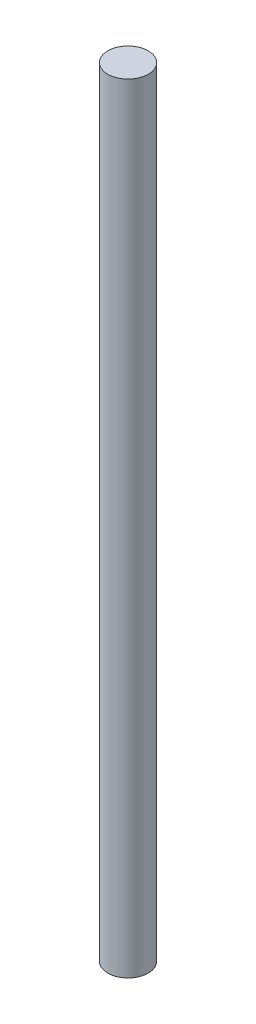
ISO-10303-21;
HEADER;
FILE_DESCRIPTION(('STEP AP214'),'2;1');
FILE_NAME('part.step','',(''),(''),'','','');
FILE_SCHEMA(('AUTOMOTIVE_DESIGN { 1 0 10303 214 1 1 1 1 }'));
ENDSEC;
DATA;
#1=APPLICATION_CONTEXT('core data for automotive mechanical design processes');
#2=APPLICATION_PROTOCOL_DEFINITION('international standard','automotive_design',2000,#1);
#3=PRODUCT_CONTEXT('',#1,'mechanical');
#4=PRODUCT('Part','Part','',(#3));
#5=PRODUCT_RELATED_PRODUCT_CATEGORY('part','',(#4));
#6=PRODUCT_DEFINITION_FORMATION('','',#4);
#7=PRODUCT_DEFINITION_CONTEXT('part definition',#1,'design');
#8=PRODUCT_DEFINITION('design','',#6,#7);
#9=PRODUCT_DEFINITION_SHAPE('','',#8);
#10=(LENGTH_UNIT() NAMED_UNIT(*) SI_UNIT(.MILLI.,.METRE.));
#11=(NAMED_UNIT(*) PLANE_ANGLE_UNIT() SI_UNIT($,.RADIAN.));
#12=(NAMED_UNIT(*) SI_UNIT($,.STERADIAN.) SOLID_ANGLE_UNIT());
#13=UNCERTAINTY_MEASURE_WITH_UNIT(LENGTH_MEASURE(1.E-05),#10,'distance_accuracy_value','');
#14=(GEOMETRIC_REPRESENTATION_CONTEXT(3) GLOBAL_UNCERTAINTY_ASSIGNED_CONTEXT((#13)) GLOBAL_UNIT_ASSIGNED_CONTEXT((#10,
#11,#12)) REPRESENTATION_CONTEXT('',''));
#15=CARTESIAN_POINT('',(0.,0.,0.));
#16=DIRECTION('',(0.,0.,1.));
#17=DIRECTION('',(1.,0.,0.));
#18=AXIS2_PLACEMENT_3D('',#15,#16,#17);
#19=CARTESIAN_POINT('',(0.,152.4,0.));
#20=DIRECTION('',(0.,-1.,0.));
#21=DIRECTION('',(0.,0.,-1.));
#22=AXIS2_PLACEMENT_3D('',#19,#20,#21);
#23=CYLINDRICAL_SURFACE('',#22,3.96875);
#24=CARTESIAN_POINT('',(0.,152.4,0.));
#25=DIRECTION('',(0.,1.,0.));
#26=DIRECTION('',(0.,0.,1.));
#27=AXIS2_PLACEMENT_3D('',#24,#25,#26);
#28=CIRCLE('',#27,3.96875);
#29=CARTESIAN_POINT('',(0.,152.4,-3.96875));
#30=VERTEX_POINT('',#29);
#31=EDGE_CURVE('E10',#30,#30,#28,.T.);
#32=CARTESIAN_POINT('',(0.,0.,0.));
#33=DIRECTION('',(0.,1.,0.));
#34=DIRECTION('',(0.,0.,1.));
#35=AXIS2_PLACEMENT_3D('',#32,#33,#34);
#36=CIRCLE('',#35,3.96875);
#37=CARTESIAN_POINT('',(0.,0.,-3.96875));
#38=VERTEX_POINT('',#37);
#39=EDGE_CURVE('E46',#38,#38,#36,.T.);
#40=CARTESIAN_POINT('',(0.,152.4,-3.96875));
#41=CARTESIAN_POINT('',(0.,150.8125,-3.96875));
#42=CARTESIAN_POINT('',(0.,149.225,-3.96875));
#43=CARTESIAN_POINT('',(0.,146.05,-3.96875));
#44=CARTESIAN_POINT('',(0.,144.4625,-3.96875));
#45=CARTESIAN_POINT('',(0.,141.2875,-3.96875));
#46=CARTESIAN_POINT('',(0.,139.7,-3.96875));
#47=CARTESIAN_POINT('',(0.,136.525,-3.96875));
#48=CARTESIAN_POINT('',(0.,134.9375,-3.96875));
#49=CARTESIAN_POINT('',(0.,131.7625,-3.96875));
#50=CARTESIAN_POINT('',(0.,130.175,-3.96875));
#51=CARTESIAN_POINT('',(0.,127.,-3.96875));
#52=CARTESIAN_POINT('',(0.,125.4125,-3.96875));
#53=CARTESIAN_POINT('',(0.,122.2375,-3.96875));
#54=CARTESIAN_POINT('',(0.,120.65,-3.96875));
#55=CARTESIAN_POINT('',(0.,117.475,-3.96875));
#56=CARTESIAN_POINT('',(0.,115.8875,-3.96875));
#57=CARTESIAN_POINT('',(0.,112.7125,-3.96875));
#58=CARTESIAN_POINT('',(0.,111.125,-3.96875));
#59=CARTESIAN_POINT('',(0.,107.95,-3.96875));
#60=CARTESIAN_POINT('',(0.,106.3625,-3.96875));
#61=CARTESIAN_POINT('',(0.,103.1875,-3.96875));
#62=CARTESIAN_POINT('',(0.,101.6,-3.96875));
#63=CARTESIAN_POINT('',(0.,98.425,-3.96875));
#64=CARTESIAN_POINT('',(0.,96.8375,-3.96875));
#65=CARTESIAN_POINT('',(0.,93.6625,-3.96875));
#66=CARTESIAN_POINT('',(0.,92.075,-3.96875));
#67=CARTESIAN_POINT('',(0.,88.9,-3.96875));
#68=CARTESIAN_POINT('',(0.,87.3125,-3.96875));
#69=CARTESIAN_POINT('',(0.,84.1375,-3.96875));
#70=CARTESIAN_POINT('',(0.,82.55,-3.96875));
#71=CARTESIAN_POINT('',(0.,79.375,-3.96875));
#72=CARTESIAN_POINT('',(0.,77.7875,-3.96875));
#73=CARTESIAN_POINT('',(0.,74.6125,-3.96875));
#74=CARTESIAN_POINT('',(0.,73.025,-3.96875));
#75=CARTESIAN_POINT('',(0.,69.85,-3.96875));
#76=CARTESIAN_POINT('',(0.,68.2625,-3.96875));
#77=CARTESIAN_POINT('',(0.,65.0875,-3.96875));
#78=CARTESIAN_POINT('',(0.,63.5,-3.96875));
#79=CARTESIAN_POINT('',(0.,60.325,-3.96875));
#80=CARTESIAN_POINT('',(0.,58.7375,-3.96875));
#81=CARTESIAN_POINT('',(0.,55.5625,-3.96875));
#82=CARTESIAN_POINT('',(0.,53.975,-3.96875));
#83=CARTESIAN_POINT('',(0.,50.8,-3.96875));
#84=CARTESIAN_POINT('',(0.,49.2125,-3.96875));
#85=CARTESIAN_POINT('',(0.,46.0375,-3.96875));
#86=CARTESIAN_POINT('',(0.,44.45,-3.96875));
#87=CARTESIAN_POINT('',(0.,41.275,-3.96875));
#88=CARTESIAN_POINT('',(0.,39.6875,-3.96875));
#89=CARTESIAN_POINT('',(0.,36.5125,-3.96875));
#90=CARTESIAN_POINT('',(0.,34.925,-3.96875));
#91=CARTESIAN_POINT('',(0.,31.75,-3.96875));
#92=CARTESIAN_POINT('',(0.,30.1625,-3.96875));
#93=CARTESIAN_POINT('',(0.,26.9875,-3.96875));
#94=CARTESIAN_POINT('',(0.,25.4,-3.96875));
#95=CARTESIAN_POINT('',(0.,22.225,-3.96875));
#96=CARTESIAN_POINT('',(0.,20.6375,-3.96875));
#97=CARTESIAN_POINT('',(0.,17.4625,-3.96875));
#98=CARTESIAN_POINT('',(0.,15.875,-3.96875));
#99=CARTESIAN_POINT('',(0.,12.7,-3.96875));
#100=CARTESIAN_POINT('',(0.,11.1125,-3.96875));
#101=CARTESIAN_POINT('',(0.,7.93750000000001,-3.96875));
#102=CARTESIAN_POINT('',(0.,6.35,-3.96875));
#103=CARTESIAN_POINT('',(0.,3.175,-3.96875));
#104=CARTESIAN_POINT('',(0.,1.5875,-3.96875));
#105=CARTESIAN_POINT('',(0.,0.,-3.96875));
#106=B_SPLINE_CURVE_WITH_KNOTS('',3,(#40,#41,#42,#43,#44,#45,#46,#47,#48,#49,#50,#51,#52,#53,
#54,#55,#56,#57,#58,#59,#60,#61,#62,#63,#64,#65,#66,#67,#68,#69,#70,#71,#72,#73,#74,#75,#76,#77,
#78,#79,#80,#81,#82,#83,#84,#85,#86,#87,#88,#89,#90,#91,#92,#93,#94,#95,#96,#97,#98,#99,#100,
#101,#102,#103,#104,#105),.UNSPECIFIED.,.F.,.F.,(4,2,2,2,2,2,2,2,2,2,2,2,2,2,2,2,2,2,2,2,2,2,2,
2,2,2,2,2,2,2,2,2,4),(0.,4.7625,9.52500000000001,14.2875,19.05,23.8125,28.575,33.3375,38.1,
42.8625,47.625,52.3875,57.15,61.9125,66.675,71.4375,76.2,80.9625,85.725,90.4875,95.25,100.0125,
104.775,109.5375,114.3,119.0625,123.825,128.5875,133.35,138.1125,142.875,147.6375,152.4),.UNSPECIFIED.);
#107=EDGE_CURVE('BSEAM43',#30,#38,#106,.T.);
#108=ORIENTED_EDGE('',*,*,#31,.F.);
#109=ORIENTED_EDGE('',*,*,#39,.T.);
#110=ORIENTED_EDGE('',*,*,#107,.T.);
#111=ORIENTED_EDGE('',*,*,#107,.F.);
#112=EDGE_LOOP('',(#108,#110,#109,#111));
#113=FACE_BOUND('',#112,.T.);
#114=ADVANCED_FACE('F43',(#113),#23,.T.);
#115=CARTESIAN_POINT('',(0.,152.4,0.));
#116=DIRECTION('',(0.,1.,0.));
#117=DIRECTION('',(0.,0.,1.));
#118=AXIS2_PLACEMENT_3D('',#115,#116,#117);
#119=PLANE('',#118);
#120=ORIENTED_EDGE('',*,*,#31,.T.);
#121=EDGE_LOOP('',(#120));
#122=FACE_BOUND('',#121,.T.);
#123=ADVANCED_FACE('F60',(#122),#119,.T.);
#124=CARTESIAN_POINT('',(0.,0.,0.));
#125=DIRECTION('',(0.,1.,0.));
#126=DIRECTION('',(0.,0.,1.));
#127=AXIS2_PLACEMENT_3D('',#124,#125,#126);
#128=PLANE('',#127);
#129=ORIENTED_EDGE('',*,*,#39,.F.);
#130=EDGE_LOOP('',(#129));
#131=FACE_BOUND('',#130,.T.);
#132=ADVANCED_FACE('F58',(#131),#128,.F.);
#133=CLOSED_SHELL('',(#114,#123,#132));
#134=MANIFOLD_SOLID_BREP('B2',#133);
#135=ADVANCED_BREP_SHAPE_REPRESENTATION('',(#18,#134),#14);
#136=SHAPE_DEFINITION_REPRESENTATION(#9,#135);
ENDSEC;
END-ISO-10303-21;
